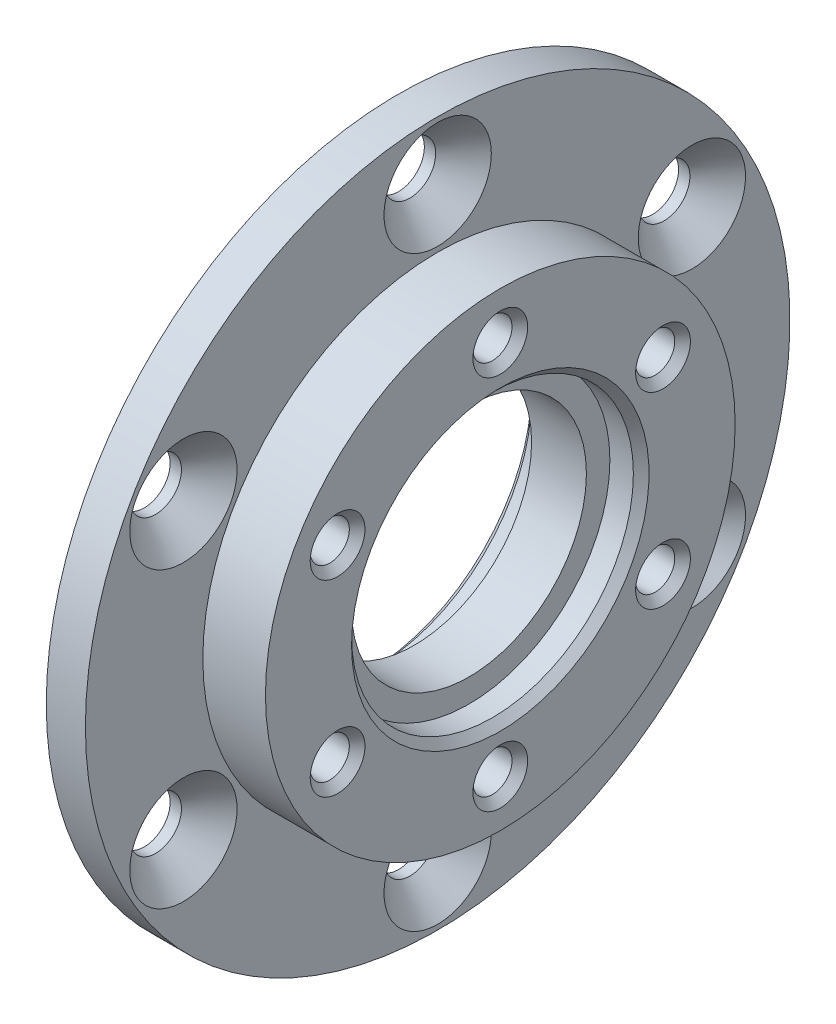
ISO-10303-21;
HEADER;
FILE_DESCRIPTION(('STEP AP214'),'2;1');
FILE_NAME('part.step','',(''),(''),'','','');
FILE_SCHEMA(('AUTOMOTIVE_DESIGN { 1 0 10303 214 1 1 1 1 }'));
ENDSEC;
DATA;
#1=APPLICATION_CONTEXT('core data for automotive mechanical design processes');
#2=APPLICATION_PROTOCOL_DEFINITION('international standard','automotive_design',2000,#1);
#3=PRODUCT_CONTEXT('',#1,'mechanical');
#4=PRODUCT('Part','Part','',(#3));
#5=PRODUCT_RELATED_PRODUCT_CATEGORY('part','',(#4));
#6=PRODUCT_DEFINITION_FORMATION('','',#4);
#7=PRODUCT_DEFINITION_CONTEXT('part definition',#1,'design');
#8=PRODUCT_DEFINITION('design','',#6,#7);
#9=PRODUCT_DEFINITION_SHAPE('','',#8);
#10=(LENGTH_UNIT() NAMED_UNIT(*) SI_UNIT(.MILLI.,.METRE.));
#11=(NAMED_UNIT(*) PLANE_ANGLE_UNIT() SI_UNIT($,.RADIAN.));
#12=(NAMED_UNIT(*) SI_UNIT($,.STERADIAN.) SOLID_ANGLE_UNIT());
#13=UNCERTAINTY_MEASURE_WITH_UNIT(LENGTH_MEASURE(1.E-05),#10,'distance_accuracy_value','');
#14=(GEOMETRIC_REPRESENTATION_CONTEXT(3) GLOBAL_UNCERTAINTY_ASSIGNED_CONTEXT((#13)) GLOBAL_UNIT_ASSIGNED_CONTEXT((#10,
#11,#12)) REPRESENTATION_CONTEXT('',''));
#15=CARTESIAN_POINT('',(0.,0.,0.));
#16=DIRECTION('',(0.,0.,1.));
#17=DIRECTION('',(1.,0.,0.));
#18=AXIS2_PLACEMENT_3D('',#15,#16,#17);
#19=CARTESIAN_POINT('',(0.,0.,0.));
#20=DIRECTION('',(-1.,0.,0.));
#21=DIRECTION('',(0.,0.,1.));
#22=AXIS2_PLACEMENT_3D('',#19,#20,#21);
#23=CYLINDRICAL_SURFACE('',#22,15.);
#24=CARTESIAN_POINT('',(6.,0.,0.));
#25=DIRECTION('',(-1.,0.,0.));
#26=DIRECTION('',(0.,0.,1.));
#27=AXIS2_PLACEMENT_3D('',#24,#25,#26);
#28=CIRCLE('',#27,15.);
#29=CARTESIAN_POINT('',(6.,0.,15.));
#30=VERTEX_POINT('',#29);
#31=EDGE_CURVE('E117',#30,#30,#28,.T.);
#32=ORIENTED_EDGE('',*,*,#31,.T.);
#33=EDGE_LOOP('',(#32));
#34=FACE_BOUND('',#33,.T.);
#35=CARTESIAN_POINT('',(13.,0.,0.));
#36=DIRECTION('',(1.,0.,0.));
#37=DIRECTION('',(0.,0.,-1.));
#38=AXIS2_PLACEMENT_3D('',#35,#36,#37);
#39=CIRCLE('',#38,15.);
#40=CARTESIAN_POINT('',(13.,0.,-15.));
#41=VERTEX_POINT('',#40);
#42=EDGE_CURVE('E230',#41,#41,#39,.T.);
#43=ORIENTED_EDGE('',*,*,#42,.T.);
#44=EDGE_LOOP('',(#43));
#45=FACE_BOUND('',#44,.T.);
#46=ADVANCED_FACE('F53',(#34,#45),#23,.F.);
#47=CARTESIAN_POINT('',(9.,45.,0.));
#48=DIRECTION('',(-1.,0.,0.));
#49=DIRECTION('',(0.,0.,1.));
#50=AXIS2_PLACEMENT_3D('',#47,#48,#49);
#51=PLANE('',#50);
#52=CARTESIAN_POINT('',(9.,18.7500000000004,32.4759526419162));
#53=DIRECTION('',(1.,0.,0.));
#54=DIRECTION('',(0.,0.,-1.));
#55=AXIS2_PLACEMENT_3D('',#52,#53,#54);
#56=CIRCLE('',#55,6.855);
#57=CARTESIAN_POINT('',(9.,18.7500000000004,25.6209526419162));
#58=VERTEX_POINT('',#57);
#59=EDGE_CURVE('E229',#58,#58,#56,.T.);
#60=ORIENTED_EDGE('',*,*,#59,.F.);
#61=EDGE_LOOP('',(#60));
#62=FACE_BOUND('',#61,.T.);
#63=CARTESIAN_POINT('',(9.,-37.5,0.));
#64=DIRECTION('',(1.,0.,0.));
#65=DIRECTION('',(0.,0.,-1.));
#66=AXIS2_PLACEMENT_3D('',#63,#64,#65);
#67=CIRCLE('',#66,6.855);
#68=CARTESIAN_POINT('',(9.,-37.5,-6.855));
#69=VERTEX_POINT('',#68);
#70=EDGE_CURVE('E154',#69,#69,#67,.T.);
#71=ORIENTED_EDGE('',*,*,#70,.F.);
#72=EDGE_LOOP('',(#71));
#73=FACE_BOUND('',#72,.T.);
#74=CARTESIAN_POINT('',(9.,-18.7500000000002,-32.4759526419164));
#75=DIRECTION('',(1.,0.,0.));
#76=DIRECTION('',(0.,0.,-1.));
#77=AXIS2_PLACEMENT_3D('',#74,#75,#76);
#78=CIRCLE('',#77,6.855);
#79=CARTESIAN_POINT('',(9.,-18.7500000000002,-39.3309526419164));
#80=VERTEX_POINT('',#79);
#81=EDGE_CURVE('E149',#80,#80,#78,.T.);
#82=ORIENTED_EDGE('',*,*,#81,.F.);
#83=EDGE_LOOP('',(#82));
#84=FACE_BOUND('',#83,.T.);
#85=CARTESIAN_POINT('',(9.,18.7499999999999,-32.4759526419165));
#86=DIRECTION('',(1.,0.,0.));
#87=DIRECTION('',(0.,0.,-1.));
#88=AXIS2_PLACEMENT_3D('',#85,#86,#87);
#89=CIRCLE('',#88,6.855);
#90=CARTESIAN_POINT('',(9.,18.7499999999999,-39.3309526419165));
#91=VERTEX_POINT('',#90);
#92=EDGE_CURVE('E144',#91,#91,#89,.T.);
#93=ORIENTED_EDGE('',*,*,#92,.F.);
#94=EDGE_LOOP('',(#93));
#95=FACE_BOUND('',#94,.T.);
#96=CARTESIAN_POINT('',(9.,37.5,0.));
#97=DIRECTION('',(1.,0.,0.));
#98=DIRECTION('',(0.,0.,-1.));
#99=AXIS2_PLACEMENT_3D('',#96,#97,#98);
#100=CIRCLE('',#99,6.855);
#101=CARTESIAN_POINT('',(9.,37.5,-6.855));
#102=VERTEX_POINT('',#101);
#103=EDGE_CURVE('E139',#102,#102,#100,.T.);
#104=ORIENTED_EDGE('',*,*,#103,.F.);
#105=EDGE_LOOP('',(#104));
#106=FACE_BOUND('',#105,.T.);
#107=CARTESIAN_POINT('',(9.,0.,0.));
#108=DIRECTION('',(-1.,0.,0.));
#109=DIRECTION('',(0.,0.,1.));
#110=AXIS2_PLACEMENT_3D('',#107,#108,#109);
#111=CIRCLE('',#110,45.);
#112=CARTESIAN_POINT('',(9.,0.,45.));
#113=VERTEX_POINT('',#112);
#114=EDGE_CURVE('E126',#113,#113,#111,.T.);
#115=ORIENTED_EDGE('',*,*,#114,.F.);
#116=EDGE_LOOP('',(#115));
#117=FACE_BOUND('',#116,.T.);
#118=CARTESIAN_POINT('',(9.,0.,0.));
#119=DIRECTION('',(-1.,0.,0.));
#120=DIRECTION('',(0.,0.,1.));
#121=AXIS2_PLACEMENT_3D('',#118,#119,#120);
#122=CIRCLE('',#121,30.);
#123=CARTESIAN_POINT('',(9.,0.,30.));
#124=VERTEX_POINT('',#123);
#125=EDGE_CURVE('E123',#124,#124,#122,.T.);
#126=ORIENTED_EDGE('',*,*,#125,.T.);
#127=EDGE_LOOP('',(#126));
#128=FACE_BOUND('',#127,.T.);
#129=CARTESIAN_POINT('',(9.,-18.7499999999997,32.4759526419166));
#130=DIRECTION('',(1.,0.,0.));
#131=DIRECTION('',(0.,0.,-1.));
#132=AXIS2_PLACEMENT_3D('',#129,#130,#131);
#133=CIRCLE('',#132,6.855);
#134=CARTESIAN_POINT('',(9.,-18.7499999999997,25.6209526419166));
#135=VERTEX_POINT('',#134);
#136=EDGE_CURVE('E159',#135,#135,#133,.T.);
#137=ORIENTED_EDGE('',*,*,#136,.F.);
#138=EDGE_LOOP('',(#137));
#139=FACE_BOUND('',#138,.T.);
#140=ADVANCED_FACE('F278',(#62,#73,#84,#95,#106,#117,#128,#139),#51,.F.);
#141=CARTESIAN_POINT('',(17.,30.,0.));
#142=DIRECTION('',(-1.,0.,0.));
#143=DIRECTION('',(0.,0.,1.));
#144=AXIS2_PLACEMENT_3D('',#141,#142,#143);
#145=PLANE('',#144);
#146=CARTESIAN_POINT('',(17.,0.,0.));
#147=DIRECTION('',(-1.,0.,0.));
#148=DIRECTION('',(0.,0.,1.));
#149=AXIS2_PLACEMENT_3D('',#146,#147,#148);
#150=CIRCLE('',#149,19.);
#151=CARTESIAN_POINT('',(17.,0.,19.));
#152=VERTEX_POINT('',#151);
#153=EDGE_CURVE('E62',#152,#152,#150,.T.);
#154=ORIENTED_EDGE('',*,*,#153,.T.);
#155=EDGE_LOOP('',(#154));
#156=FACE_BOUND('',#155,.T.);
#157=CARTESIAN_POINT('',(17.,-24.,0.));
#158=DIRECTION('',(-1.,0.,0.));
#159=DIRECTION('',(0.,0.,1.));
#160=AXIS2_PLACEMENT_3D('',#157,#158,#159);
#161=CIRCLE('',#160,3.50000000000002);
#162=CARTESIAN_POINT('',(17.,-24.,3.50000000000002));
#163=VERTEX_POINT('',#162);
#164=EDGE_CURVE('E178',#163,#163,#161,.T.);
#165=ORIENTED_EDGE('',*,*,#164,.T.);
#166=EDGE_LOOP('',(#165));
#167=FACE_BOUND('',#166,.T.);
#168=CARTESIAN_POINT('',(17.,-12.0000000000001,-20.7846096908265));
#169=DIRECTION('',(-1.,0.,0.));
#170=DIRECTION('',(0.,0.,1.));
#171=AXIS2_PLACEMENT_3D('',#168,#169,#170);
#172=CIRCLE('',#171,3.49999999999998);
#173=CARTESIAN_POINT('',(17.,-12.0000000000001,-17.2846096908265));
#174=VERTEX_POINT('',#173);
#175=EDGE_CURVE('E175',#174,#174,#172,.T.);
#176=ORIENTED_EDGE('',*,*,#175,.T.);
#177=EDGE_LOOP('',(#176));
#178=FACE_BOUND('',#177,.T.);
#179=CARTESIAN_POINT('',(17.,-11.9999999999998,20.7846096908266));
#180=DIRECTION('',(-1.,0.,0.));
#181=DIRECTION('',(0.,0.,1.));
#182=AXIS2_PLACEMENT_3D('',#179,#180,#181);
#183=CIRCLE('',#182,3.49999999999998);
#184=CARTESIAN_POINT('',(17.,-11.9999999999998,24.2846096908266));
#185=VERTEX_POINT('',#184);
#186=EDGE_CURVE('E172',#185,#185,#183,.T.);
#187=ORIENTED_EDGE('',*,*,#186,.T.);
#188=EDGE_LOOP('',(#187));
#189=FACE_BOUND('',#188,.T.);
#190=CARTESIAN_POINT('',(17.,12.0000000000002,20.7846096908264));
#191=DIRECTION('',(-1.,0.,0.));
#192=DIRECTION('',(0.,0.,1.));
#193=AXIS2_PLACEMENT_3D('',#190,#191,#192);
#194=CIRCLE('',#193,3.49999999999998);
#195=CARTESIAN_POINT('',(17.,12.0000000000002,24.2846096908264));
#196=VERTEX_POINT('',#195);
#197=EDGE_CURVE('E169',#196,#196,#194,.T.);
#198=ORIENTED_EDGE('',*,*,#197,.T.);
#199=EDGE_LOOP('',(#198));
#200=FACE_BOUND('',#199,.T.);
#201=CARTESIAN_POINT('',(17.,12.,-20.7846096908266));
#202=DIRECTION('',(-1.,0.,0.));
#203=DIRECTION('',(0.,0.,1.));
#204=AXIS2_PLACEMENT_3D('',#201,#202,#203);
#205=CIRCLE('',#204,3.50000000000002);
#206=CARTESIAN_POINT('',(17.,12.,-17.2846096908265));
#207=VERTEX_POINT('',#206);
#208=EDGE_CURVE('E166',#207,#207,#205,.T.);
#209=ORIENTED_EDGE('',*,*,#208,.T.);
#210=EDGE_LOOP('',(#209));
#211=FACE_BOUND('',#210,.T.);
#212=CARTESIAN_POINT('',(17.,24.,0.));
#213=DIRECTION('',(-1.,0.,0.));
#214=DIRECTION('',(0.,0.,1.));
#215=AXIS2_PLACEMENT_3D('',#212,#213,#214);
#216=CIRCLE('',#215,3.50000000000002);
#217=CARTESIAN_POINT('',(17.,24.,3.50000000000002));
#218=VERTEX_POINT('',#217);
#219=EDGE_CURVE('E163',#218,#218,#216,.T.);
#220=ORIENTED_EDGE('',*,*,#219,.T.);
#221=EDGE_LOOP('',(#220));
#222=FACE_BOUND('',#221,.T.);
#223=CARTESIAN_POINT('',(17.,0.,0.));
#224=DIRECTION('',(-1.,0.,0.));
#225=DIRECTION('',(0.,0.,1.));
#226=AXIS2_PLACEMENT_3D('',#223,#224,#225);
#227=CIRCLE('',#226,30.);
#228=CARTESIAN_POINT('',(17.,0.,30.));
#229=VERTEX_POINT('',#228);
#230=EDGE_CURVE('E120',#229,#229,#227,.T.);
#231=ORIENTED_EDGE('',*,*,#230,.F.);
#232=EDGE_LOOP('',(#231));
#233=FACE_BOUND('',#232,.T.);
#234=ADVANCED_FACE('F210',(#156,#167,#178,#189,#200,#211,#222,#233),#145,.F.);
#235=CARTESIAN_POINT('',(0.,0.,0.));
#236=DIRECTION('',(-1.,0.,0.));
#237=DIRECTION('',(0.,0.,1.));
#238=AXIS2_PLACEMENT_3D('',#235,#236,#237);
#239=CYLINDRICAL_SURFACE('',#238,20.);
#240=CARTESIAN_POINT('',(0.999999999999973,0.,0.));
#241=DIRECTION('',(1.,0.,0.));
#242=DIRECTION('',(0.,0.,-1.));
#243=AXIS2_PLACEMENT_3D('',#240,#241,#242);
#244=CIRCLE('',#243,20.);
#245=CARTESIAN_POINT('',(0.999999999999973,0.,-20.));
#246=VERTEX_POINT('',#245);
#247=EDGE_CURVE('E11',#246,#246,#244,.F.);
#248=ORIENTED_EDGE('',*,*,#247,.T.);
#249=EDGE_LOOP('',(#248));
#250=FACE_BOUND('',#249,.T.);
#251=CARTESIAN_POINT('',(6.,0.,0.));
#252=DIRECTION('',(-1.,0.,0.));
#253=DIRECTION('',(0.,0.,1.));
#254=AXIS2_PLACEMENT_3D('',#251,#252,#253);
#255=CIRCLE('',#254,20.);
#256=CARTESIAN_POINT('',(6.,0.,20.));
#257=VERTEX_POINT('',#256);
#258=EDGE_CURVE('E114',#257,#257,#255,.T.);
#259=ORIENTED_EDGE('',*,*,#258,.F.);
#260=EDGE_LOOP('',(#259));
#261=FACE_BOUND('',#260,.T.);
#262=ADVANCED_FACE('F295',(#250,#261),#239,.F.);
#263=CARTESIAN_POINT('',(0.,20.,0.));
#264=DIRECTION('',(1.,0.,0.));
#265=DIRECTION('',(0.,0.,-1.));
#266=AXIS2_PLACEMENT_3D('',#263,#264,#265);
#267=PLANE('',#266);
#268=CARTESIAN_POINT('',(0.,0.,0.));
#269=DIRECTION('',(1.,0.,0.));
#270=DIRECTION('',(0.,0.,-1.));
#271=AXIS2_PLACEMENT_3D('',#268,#269,#270);
#272=CIRCLE('',#271,26.5);
#273=CARTESIAN_POINT('',(0.,0.,-26.5));
#274=VERTEX_POINT('',#273);
#275=EDGE_CURVE('E199',#274,#274,#272,.F.);
#276=ORIENTED_EDGE('',*,*,#275,.T.);
#277=EDGE_LOOP('',(#276));
#278=FACE_BOUND('',#277,.T.);
#279=CARTESIAN_POINT('',(0.,0.,0.));
#280=DIRECTION('',(1.,0.,0.));
#281=DIRECTION('',(0.,0.,-1.));
#282=AXIS2_PLACEMENT_3D('',#279,#280,#281);
#283=CIRCLE('',#282,21.);
#284=CARTESIAN_POINT('',(0.,0.,-21.));
#285=VERTEX_POINT('',#284);
#286=EDGE_CURVE('E196',#285,#285,#283,.T.);
#287=ORIENTED_EDGE('',*,*,#286,.T.);
#288=EDGE_LOOP('',(#287));
#289=FACE_BOUND('',#288,.T.);
#290=ADVANCED_FACE('F311',(#278,#289),#267,.F.);
#291=CARTESIAN_POINT('',(0.,0.,0.));
#292=DIRECTION('',(-1.,0.,0.));
#293=DIRECTION('',(0.,0.,1.));
#294=AXIS2_PLACEMENT_3D('',#291,#292,#293);
#295=CYLINDRICAL_SURFACE('',#294,27.5);
#296=CARTESIAN_POINT('',(0.999999999999987,0.,0.));
#297=DIRECTION('',(1.,0.,0.));
#298=DIRECTION('',(0.,0.,-1.));
#299=AXIS2_PLACEMENT_3D('',#296,#297,#298);
#300=CIRCLE('',#299,27.5);
#301=CARTESIAN_POINT('',(0.999999999999987,0.,-27.5));
#302=VERTEX_POINT('',#301);
#303=EDGE_CURVE('E202',#302,#302,#300,.T.);
#304=ORIENTED_EDGE('',*,*,#303,.T.);
#305=EDGE_LOOP('',(#304));
#306=FACE_BOUND('',#305,.T.);
#307=CARTESIAN_POINT('',(4.,0.,0.));
#308=DIRECTION('',(-1.,0.,0.));
#309=DIRECTION('',(0.,0.,1.));
#310=AXIS2_PLACEMENT_3D('',#307,#308,#309);
#311=CIRCLE('',#310,27.5);
#312=CARTESIAN_POINT('',(4.,0.,27.5));
#313=VERTEX_POINT('',#312);
#314=EDGE_CURVE('E132',#313,#313,#311,.T.);
#315=ORIENTED_EDGE('',*,*,#314,.T.);
#316=EDGE_LOOP('',(#315));
#317=FACE_BOUND('',#316,.T.);
#318=ADVANCED_FACE('F307',(#306,#317),#295,.T.);
#319=CARTESIAN_POINT('',(4.,27.5,0.));
#320=DIRECTION('',(1.,0.,0.));
#321=DIRECTION('',(0.,0.,-1.));
#322=AXIS2_PLACEMENT_3D('',#319,#320,#321);
#323=PLANE('',#322);
#324=CARTESIAN_POINT('',(4.,18.7500000000004,32.4759526419162));
#325=DIRECTION('',(1.,0.,0.));
#326=DIRECTION('',(0.,0.,-1.));
#327=AXIS2_PLACEMENT_3D('',#324,#325,#326);
#328=CIRCLE('',#327,3.3);
#329=CARTESIAN_POINT('',(4.,18.7500000000004,29.1759526419162));
#330=VERTEX_POINT('',#329);
#331=EDGE_CURVE('E156',#330,#330,#328,.T.);
#332=ORIENTED_EDGE('',*,*,#331,.T.);
#333=EDGE_LOOP('',(#332));
#334=FACE_BOUND('',#333,.T.);
#335=CARTESIAN_POINT('',(4.,-18.7499999999997,32.4759526419166));
#336=DIRECTION('',(1.,0.,0.));
#337=DIRECTION('',(0.,0.,-1.));
#338=AXIS2_PLACEMENT_3D('',#335,#336,#337);
#339=CIRCLE('',#338,3.3);
#340=CARTESIAN_POINT('',(4.,-18.7499999999997,29.1759526419166));
#341=VERTEX_POINT('',#340);
#342=EDGE_CURVE('E151',#341,#341,#339,.T.);
#343=ORIENTED_EDGE('',*,*,#342,.T.);
#344=EDGE_LOOP('',(#343));
#345=FACE_BOUND('',#344,.T.);
#346=CARTESIAN_POINT('',(4.,-37.5,0.));
#347=DIRECTION('',(1.,0.,0.));
#348=DIRECTION('',(0.,0.,-1.));
#349=AXIS2_PLACEMENT_3D('',#346,#347,#348);
#350=CIRCLE('',#349,3.3);
#351=CARTESIAN_POINT('',(4.,-37.5,-3.3));
#352=VERTEX_POINT('',#351);
#353=EDGE_CURVE('E146',#352,#352,#350,.T.);
#354=ORIENTED_EDGE('',*,*,#353,.T.);
#355=EDGE_LOOP('',(#354));
#356=FACE_BOUND('',#355,.T.);
#357=CARTESIAN_POINT('',(4.,-18.7500000000002,-32.4759526419164));
#358=DIRECTION('',(1.,0.,0.));
#359=DIRECTION('',(0.,0.,-1.));
#360=AXIS2_PLACEMENT_3D('',#357,#358,#359);
#361=CIRCLE('',#360,3.3);
#362=CARTESIAN_POINT('',(4.,-18.7500000000002,-35.7759526419164));
#363=VERTEX_POINT('',#362);
#364=EDGE_CURVE('E141',#363,#363,#361,.T.);
#365=ORIENTED_EDGE('',*,*,#364,.T.);
#366=EDGE_LOOP('',(#365));
#367=FACE_BOUND('',#366,.T.);
#368=CARTESIAN_POINT('',(4.,18.7499999999999,-32.4759526419165));
#369=DIRECTION('',(1.,0.,0.));
#370=DIRECTION('',(0.,0.,-1.));
#371=AXIS2_PLACEMENT_3D('',#368,#369,#370);
#372=CIRCLE('',#371,3.3);
#373=CARTESIAN_POINT('',(4.,18.7499999999999,-35.7759526419165));
#374=VERTEX_POINT('',#373);
#375=EDGE_CURVE('E136',#374,#374,#372,.T.);
#376=ORIENTED_EDGE('',*,*,#375,.T.);
#377=EDGE_LOOP('',(#376));
#378=FACE_BOUND('',#377,.T.);
#379=CARTESIAN_POINT('',(4.,37.5,0.));
#380=DIRECTION('',(1.,0.,0.));
#381=DIRECTION('',(0.,0.,-1.));
#382=AXIS2_PLACEMENT_3D('',#379,#380,#381);
#383=CIRCLE('',#382,3.3);
#384=CARTESIAN_POINT('',(4.,37.5,-3.3));
#385=VERTEX_POINT('',#384);
#386=EDGE_CURVE('E92',#385,#385,#383,.T.);
#387=ORIENTED_EDGE('',*,*,#386,.T.);
#388=EDGE_LOOP('',(#387));
#389=FACE_BOUND('',#388,.T.);
#390=ORIENTED_EDGE('',*,*,#314,.F.);
#391=EDGE_LOOP('',(#390));
#392=FACE_BOUND('',#391,.T.);
#393=CARTESIAN_POINT('',(4.,0.,0.));
#394=DIRECTION('',(-1.,0.,0.));
#395=DIRECTION('',(0.,0.,1.));
#396=AXIS2_PLACEMENT_3D('',#393,#394,#395);
#397=CIRCLE('',#396,45.);
#398=CARTESIAN_POINT('',(4.,0.,45.));
#399=VERTEX_POINT('',#398);
#400=EDGE_CURVE('E129',#399,#399,#397,.T.);
#401=ORIENTED_EDGE('',*,*,#400,.T.);
#402=EDGE_LOOP('',(#401));
#403=FACE_BOUND('',#402,.T.);
#404=ADVANCED_FACE('F303',(#334,#345,#356,#367,#378,#389,#392,#403),#323,.F.);
#405=CARTESIAN_POINT('',(0.,0.,0.));
#406=DIRECTION('',(-1.,0.,0.));
#407=DIRECTION('',(0.,0.,1.));
#408=AXIS2_PLACEMENT_3D('',#405,#406,#407);
#409=CYLINDRICAL_SURFACE('',#408,45.);
#410=ORIENTED_EDGE('',*,*,#400,.F.);
#411=EDGE_LOOP('',(#410));
#412=FACE_BOUND('',#411,.T.);
#413=ORIENTED_EDGE('',*,*,#114,.T.);
#414=EDGE_LOOP('',(#413));
#415=FACE_BOUND('',#414,.T.);
#416=ADVANCED_FACE('F298',(#412,#415),#409,.T.);
#417=CARTESIAN_POINT('',(0.,0.,0.));
#418=DIRECTION('',(-1.,0.,0.));
#419=DIRECTION('',(0.,0.,1.));
#420=AXIS2_PLACEMENT_3D('',#417,#418,#419);
#421=CYLINDRICAL_SURFACE('',#420,30.);
#422=ORIENTED_EDGE('',*,*,#125,.F.);
#423=EDGE_LOOP('',(#422));
#424=FACE_BOUND('',#423,.T.);
#425=ORIENTED_EDGE('',*,*,#230,.T.);
#426=EDGE_LOOP('',(#425));
#427=FACE_BOUND('',#426,.T.);
#428=ADVANCED_FACE('F296',(#424,#427),#421,.T.);
#429=CARTESIAN_POINT('',(6.,15.,0.));
#430=DIRECTION('',(1.,0.,0.));
#431=DIRECTION('',(0.,0.,-1.));
#432=AXIS2_PLACEMENT_3D('',#429,#430,#431);
#433=PLANE('',#432);
#434=ORIENTED_EDGE('',*,*,#31,.F.);
#435=EDGE_LOOP('',(#434));
#436=FACE_BOUND('',#435,.T.);
#437=ORIENTED_EDGE('',*,*,#258,.T.);
#438=EDGE_LOOP('',(#437));
#439=FACE_BOUND('',#438,.T.);
#440=ADVANCED_FACE('F291',(#436,#439),#433,.F.);
#441=CARTESIAN_POINT('',(8.5021515475689,24.,0.));
#442=DIRECTION('',(1.,0.,0.));
#443=DIRECTION('',(0.,0.,-1.));
#444=AXIS2_PLACEMENT_3D('',#441,#442,#443);
#445=CONICAL_SURFACE('',#444,2.5,1.02974425867665);
#446=CARTESIAN_POINT('',(7.,24.,0.));
#447=VERTEX_POINT('',#446);
#448=VERTEX_LOOP('',#447);
#449=FACE_BOUND('',#448,.T.);
#450=CARTESIAN_POINT('',(8.5021515475689,24.,0.));
#451=DIRECTION('',(1.,0.,0.));
#452=DIRECTION('',(0.,0.,-1.));
#453=AXIS2_PLACEMENT_3D('',#450,#451,#452);
#454=CIRCLE('',#453,2.5);
#455=CARTESIAN_POINT('',(8.5021515475689,24.,-2.5));
#456=VERTEX_POINT('',#455);
#457=EDGE_CURVE('E111',#456,#456,#454,.T.);
#458=ORIENTED_EDGE('',*,*,#457,.T.);
#459=EDGE_LOOP('',(#458));
#460=FACE_BOUND('',#459,.T.);
#461=ADVANCED_FACE('F386',(#449,#460),#445,.F.);
#462=CARTESIAN_POINT('',(17.,24.,0.));
#463=DIRECTION('',(1.,0.,0.));
#464=DIRECTION('',(0.,0.,-1.));
#465=AXIS2_PLACEMENT_3D('',#462,#463,#464);
#466=CYLINDRICAL_SURFACE('',#465,2.5);
#467=CARTESIAN_POINT('',(16.,24.,0.));
#468=DIRECTION('',(-1.,0.,0.));
#469=DIRECTION('',(0.,0.,1.));
#470=AXIS2_PLACEMENT_3D('',#467,#468,#469);
#471=CIRCLE('',#470,2.5);
#472=CARTESIAN_POINT('',(16.,24.,2.5));
#473=VERTEX_POINT('',#472);
#474=EDGE_CURVE('E193',#473,#473,#471,.F.);
#475=ORIENTED_EDGE('',*,*,#474,.T.);
#476=EDGE_LOOP('',(#475));
#477=FACE_BOUND('',#476,.T.);
#478=ORIENTED_EDGE('',*,*,#457,.F.);
#479=EDGE_LOOP('',(#478));
#480=FACE_BOUND('',#479,.T.);
#481=ADVANCED_FACE('F391',(#477,#480),#466,.F.);
#482=CARTESIAN_POINT('',(8.5021515475689,12.,-20.7846096908266));
#483=DIRECTION('',(1.,0.,0.));
#484=DIRECTION('',(0.,0.,-1.));
#485=AXIS2_PLACEMENT_3D('',#482,#483,#484);
#486=CONICAL_SURFACE('',#485,2.5,1.02974425867665);
#487=CARTESIAN_POINT('',(7.,11.9999999999999,-20.7846096908266));
#488=VERTEX_POINT('',#487);
#489=VERTEX_LOOP('',#488);
#490=FACE_BOUND('',#489,.T.);
#491=CARTESIAN_POINT('',(8.5021515475689,12.,-20.7846096908266));
#492=DIRECTION('',(1.,0.,0.));
#493=DIRECTION('',(0.,0.,-1.));
#494=AXIS2_PLACEMENT_3D('',#491,#492,#493);
#495=CIRCLE('',#494,2.5);
#496=CARTESIAN_POINT('',(8.5021515475689,12.,-23.2846096908266));
#497=VERTEX_POINT('',#496);
#498=EDGE_CURVE('E108',#497,#497,#495,.T.);
#499=ORIENTED_EDGE('',*,*,#498,.T.);
#500=EDGE_LOOP('',(#499));
#501=FACE_BOUND('',#500,.T.);
#502=ADVANCED_FACE('F397',(#490,#501),#486,.F.);
#503=CARTESIAN_POINT('',(17.,12.,-20.7846096908266));
#504=DIRECTION('',(1.,0.,0.));
#505=DIRECTION('',(0.,0.,-1.));
#506=AXIS2_PLACEMENT_3D('',#503,#504,#505);
#507=CYLINDRICAL_SURFACE('',#506,2.5);
#508=CARTESIAN_POINT('',(16.,12.,-20.7846096908266));
#509=DIRECTION('',(-1.,0.,0.));
#510=DIRECTION('',(0.,0.,1.));
#511=AXIS2_PLACEMENT_3D('',#508,#509,#510);
#512=CIRCLE('',#511,2.5);
#513=CARTESIAN_POINT('',(16.,12.,-18.2846096908266));
#514=VERTEX_POINT('',#513);
#515=EDGE_CURVE('E190',#514,#514,#512,.F.);
#516=ORIENTED_EDGE('',*,*,#515,.T.);
#517=EDGE_LOOP('',(#516));
#518=FACE_BOUND('',#517,.T.);
#519=ORIENTED_EDGE('',*,*,#498,.F.);
#520=EDGE_LOOP('',(#519));
#521=FACE_BOUND('',#520,.T.);
#522=ADVANCED_FACE('F403',(#518,#521),#507,.F.);
#523=CARTESIAN_POINT('',(8.5021515475689,-12.0000000000001,-20.7846096908265));
#524=DIRECTION('',(1.,0.,0.));
#525=DIRECTION('',(0.,0.,-1.));
#526=AXIS2_PLACEMENT_3D('',#523,#524,#525);
#527=CONICAL_SURFACE('',#526,2.5,1.02974425867665);
#528=CARTESIAN_POINT('',(7.,-12.0000000000001,-20.7846096908265));
#529=VERTEX_POINT('',#528);
#530=VERTEX_LOOP('',#529);
#531=FACE_BOUND('',#530,.T.);
#532=CARTESIAN_POINT('',(8.5021515475689,-12.0000000000001,-20.7846096908265));
#533=DIRECTION('',(1.,0.,0.));
#534=DIRECTION('',(0.,0.,-1.));
#535=AXIS2_PLACEMENT_3D('',#532,#533,#534);
#536=CIRCLE('',#535,2.5);
#537=CARTESIAN_POINT('',(8.5021515475689,-12.0000000000001,-23.2846096908265));
#538=VERTEX_POINT('',#537);
#539=EDGE_CURVE('E105',#538,#538,#536,.T.);
#540=ORIENTED_EDGE('',*,*,#539,.T.);
#541=EDGE_LOOP('',(#540));
#542=FACE_BOUND('',#541,.T.);
#543=ADVANCED_FACE('F406',(#531,#542),#527,.F.);
#544=CARTESIAN_POINT('',(17.,-12.0000000000001,-20.7846096908265));
#545=DIRECTION('',(1.,0.,0.));
#546=DIRECTION('',(0.,0.,-1.));
#547=AXIS2_PLACEMENT_3D('',#544,#545,#546);
#548=CYLINDRICAL_SURFACE('',#547,2.5);
#549=CARTESIAN_POINT('',(16.,-12.0000000000001,-20.7846096908265));
#550=DIRECTION('',(-1.,0.,0.));
#551=DIRECTION('',(0.,0.,1.));
#552=AXIS2_PLACEMENT_3D('',#549,#550,#551);
#553=CIRCLE('',#552,2.5);
#554=CARTESIAN_POINT('',(16.,-12.0000000000001,-18.2846096908265));
#555=VERTEX_POINT('',#554);
#556=EDGE_CURVE('E181',#555,#555,#553,.F.);
#557=ORIENTED_EDGE('',*,*,#556,.T.);
#558=EDGE_LOOP('',(#557));
#559=FACE_BOUND('',#558,.T.);
#560=ORIENTED_EDGE('',*,*,#539,.F.);
#561=EDGE_LOOP('',(#560));
#562=FACE_BOUND('',#561,.T.);
#563=ADVANCED_FACE('F410',(#559,#562),#548,.F.);
#564=CARTESIAN_POINT('',(8.5021515475689,-24.,0.));
#565=DIRECTION('',(1.,0.,0.));
#566=DIRECTION('',(0.,0.,-1.));
#567=AXIS2_PLACEMENT_3D('',#564,#565,#566);
#568=CONICAL_SURFACE('',#567,2.5,1.02974425867665);
#569=CARTESIAN_POINT('',(7.,-24.,0.));
#570=VERTEX_POINT('',#569);
#571=VERTEX_LOOP('',#570);
#572=FACE_BOUND('',#571,.T.);
#573=CARTESIAN_POINT('',(8.5021515475689,-24.,0.));
#574=DIRECTION('',(1.,0.,0.));
#575=DIRECTION('',(0.,0.,-1.));
#576=AXIS2_PLACEMENT_3D('',#573,#574,#575);
#577=CIRCLE('',#576,2.5);
#578=CARTESIAN_POINT('',(8.5021515475689,-24.,-2.5));
#579=VERTEX_POINT('',#578);
#580=EDGE_CURVE('E95',#579,#579,#577,.T.);
#581=ORIENTED_EDGE('',*,*,#580,.T.);
#582=EDGE_LOOP('',(#581));
#583=FACE_BOUND('',#582,.T.);
#584=ADVANCED_FACE('F414',(#572,#583),#568,.F.);
#585=CARTESIAN_POINT('',(17.,-24.,0.));
#586=DIRECTION('',(1.,0.,0.));
#587=DIRECTION('',(0.,0.,-1.));
#588=AXIS2_PLACEMENT_3D('',#585,#586,#587);
#589=CYLINDRICAL_SURFACE('',#588,2.5);
#590=CARTESIAN_POINT('',(16.,-24.,0.));
#591=DIRECTION('',(-1.,0.,0.));
#592=DIRECTION('',(0.,0.,1.));
#593=AXIS2_PLACEMENT_3D('',#590,#591,#592);
#594=CIRCLE('',#593,2.5);
#595=CARTESIAN_POINT('',(16.,-24.,2.5));
#596=VERTEX_POINT('',#595);
#597=EDGE_CURVE('E134',#596,#596,#594,.F.);
#598=ORIENTED_EDGE('',*,*,#597,.T.);
#599=EDGE_LOOP('',(#598));
#600=FACE_BOUND('',#599,.T.);
#601=ORIENTED_EDGE('',*,*,#580,.F.);
#602=EDGE_LOOP('',(#601));
#603=FACE_BOUND('',#602,.T.);
#604=ADVANCED_FACE('F418',(#600,#603),#589,.F.);
#605=CARTESIAN_POINT('',(8.5021515475689,-11.9999999999998,20.7846096908266));
#606=DIRECTION('',(1.,0.,0.));
#607=DIRECTION('',(0.,0.,-1.));
#608=AXIS2_PLACEMENT_3D('',#605,#606,#607);
#609=CONICAL_SURFACE('',#608,2.5,1.02974425867665);
#610=CARTESIAN_POINT('',(7.,-11.9999999999998,20.7846096908266));
#611=VERTEX_POINT('',#610);
#612=VERTEX_LOOP('',#611);
#613=FACE_BOUND('',#612,.T.);
#614=CARTESIAN_POINT('',(8.5021515475689,-11.9999999999998,20.7846096908266));
#615=DIRECTION('',(1.,0.,0.));
#616=DIRECTION('',(0.,0.,-1.));
#617=AXIS2_PLACEMENT_3D('',#614,#615,#616);
#618=CIRCLE('',#617,2.5);
#619=CARTESIAN_POINT('',(8.5021515475689,-11.9999999999998,18.2846096908266));
#620=VERTEX_POINT('',#619);
#621=EDGE_CURVE('E91',#620,#620,#618,.T.);
#622=ORIENTED_EDGE('',*,*,#621,.T.);
#623=EDGE_LOOP('',(#622));
#624=FACE_BOUND('',#623,.T.);
#625=ADVANCED_FACE('F422',(#613,#624),#609,.F.);
#626=CARTESIAN_POINT('',(17.,-11.9999999999998,20.7846096908266));
#627=DIRECTION('',(1.,0.,0.));
#628=DIRECTION('',(0.,0.,-1.));
#629=AXIS2_PLACEMENT_3D('',#626,#627,#628);
#630=CYLINDRICAL_SURFACE('',#629,2.5);
#631=CARTESIAN_POINT('',(16.,-11.9999999999998,20.7846096908266));
#632=DIRECTION('',(-1.,0.,0.));
#633=DIRECTION('',(0.,0.,1.));
#634=AXIS2_PLACEMENT_3D('',#631,#632,#633);
#635=CIRCLE('',#634,2.5);
#636=CARTESIAN_POINT('',(16.,-11.9999999999998,23.2846096908266));
#637=VERTEX_POINT('',#636);
#638=EDGE_CURVE('E184',#637,#637,#635,.F.);
#639=ORIENTED_EDGE('',*,*,#638,.T.);
#640=EDGE_LOOP('',(#639));
#641=FACE_BOUND('',#640,.T.);
#642=ORIENTED_EDGE('',*,*,#621,.F.);
#643=EDGE_LOOP('',(#642));
#644=FACE_BOUND('',#643,.T.);
#645=ADVANCED_FACE('F85',(#641,#644),#630,.F.);
#646=CARTESIAN_POINT('',(8.5021515475689,12.0000000000002,20.7846096908264));
#647=DIRECTION('',(1.,0.,0.));
#648=DIRECTION('',(0.,0.,-1.));
#649=AXIS2_PLACEMENT_3D('',#646,#647,#648);
#650=CONICAL_SURFACE('',#649,2.5,1.02974425867665);
#651=CARTESIAN_POINT('',(7.,12.0000000000002,20.7846096908264));
#652=VERTEX_POINT('',#651);
#653=VERTEX_LOOP('',#652);
#654=FACE_BOUND('',#653,.T.);
#655=CARTESIAN_POINT('',(8.5021515475689,12.0000000000002,20.7846096908264));
#656=DIRECTION('',(1.,0.,0.));
#657=DIRECTION('',(0.,0.,-1.));
#658=AXIS2_PLACEMENT_3D('',#655,#656,#657);
#659=CIRCLE('',#658,2.5);
#660=CARTESIAN_POINT('',(8.5021515475689,12.0000000000002,18.2846096908264));
#661=VERTEX_POINT('',#660);
#662=EDGE_CURVE('E89',#661,#661,#659,.T.);
#663=ORIENTED_EDGE('',*,*,#662,.T.);
#664=EDGE_LOOP('',(#663));
#665=FACE_BOUND('',#664,.T.);
#666=ADVANCED_FACE('F81',(#654,#665),#650,.F.);
#667=CARTESIAN_POINT('',(17.,12.0000000000002,20.7846096908264));
#668=DIRECTION('',(1.,0.,0.));
#669=DIRECTION('',(0.,0.,-1.));
#670=AXIS2_PLACEMENT_3D('',#667,#668,#669);
#671=CYLINDRICAL_SURFACE('',#670,2.5);
#672=CARTESIAN_POINT('',(16.,12.0000000000002,20.7846096908264));
#673=DIRECTION('',(-1.,0.,0.));
#674=DIRECTION('',(0.,0.,1.));
#675=AXIS2_PLACEMENT_3D('',#672,#673,#674);
#676=CIRCLE('',#675,2.5);
#677=CARTESIAN_POINT('',(16.,12.0000000000002,23.2846096908264));
#678=VERTEX_POINT('',#677);
#679=EDGE_CURVE('E187',#678,#678,#676,.F.);
#680=ORIENTED_EDGE('',*,*,#679,.T.);
#681=EDGE_LOOP('',(#680));
#682=FACE_BOUND('',#681,.T.);
#683=ORIENTED_EDGE('',*,*,#662,.F.);
#684=EDGE_LOOP('',(#683));
#685=FACE_BOUND('',#684,.T.);
#686=ADVANCED_FACE('F84',(#682,#685),#671,.F.);
#687=CARTESIAN_POINT('',(9.,37.5,0.));
#688=DIRECTION('',(1.,0.,0.));
#689=DIRECTION('',(0.,0.,-1.));
#690=AXIS2_PLACEMENT_3D('',#687,#688,#689);
#691=CYLINDRICAL_SURFACE('',#690,3.3);
#692=CARTESIAN_POINT('',(5.445,37.5,0.));
#693=DIRECTION('',(1.,0.,0.));
#694=DIRECTION('',(0.,0.,-1.));
#695=AXIS2_PLACEMENT_3D('',#692,#693,#694);
#696=CIRCLE('',#695,3.3);
#697=CARTESIAN_POINT('',(5.445,37.5,-3.3));
#698=VERTEX_POINT('',#697);
#699=EDGE_CURVE('E98',#698,#698,#696,.T.);
#700=ORIENTED_EDGE('',*,*,#699,.T.);
#701=EDGE_LOOP('',(#700));
#702=FACE_BOUND('',#701,.T.);
#703=ORIENTED_EDGE('',*,*,#386,.F.);
#704=EDGE_LOOP('',(#703));
#705=FACE_BOUND('',#704,.T.);
#706=ADVANCED_FACE('F260',(#702,#705),#691,.F.);
#707=CARTESIAN_POINT('',(9.,37.5,0.));
#708=DIRECTION('',(1.,0.,0.));
#709=DIRECTION('',(0.,0.,-1.));
#710=AXIS2_PLACEMENT_3D('',#707,#708,#709);
#711=CONICAL_SURFACE('',#710,6.855,0.785398163397448);
#712=ORIENTED_EDGE('',*,*,#699,.F.);
#713=EDGE_LOOP('',(#712));
#714=FACE_BOUND('',#713,.T.);
#715=ORIENTED_EDGE('',*,*,#103,.T.);
#716=EDGE_LOOP('',(#715));
#717=FACE_BOUND('',#716,.T.);
#718=ADVANCED_FACE('F263',(#714,#717),#711,.F.);
#719=CARTESIAN_POINT('',(9.,18.7499999999999,-32.4759526419165));
#720=DIRECTION('',(1.,0.,0.));
#721=DIRECTION('',(0.,0.,-1.));
#722=AXIS2_PLACEMENT_3D('',#719,#720,#721);
#723=CYLINDRICAL_SURFACE('',#722,3.3);
#724=CARTESIAN_POINT('',(5.445,18.7499999999999,-32.4759526419165));
#725=DIRECTION('',(1.,0.,0.));
#726=DIRECTION('',(0.,0.,-1.));
#727=AXIS2_PLACEMENT_3D('',#724,#725,#726);
#728=CIRCLE('',#727,3.3);
#729=CARTESIAN_POINT('',(5.445,18.7499999999999,-35.7759526419165));
#730=VERTEX_POINT('',#729);
#731=EDGE_CURVE('E140',#730,#730,#728,.T.);
#732=ORIENTED_EDGE('',*,*,#731,.T.);
#733=EDGE_LOOP('',(#732));
#734=FACE_BOUND('',#733,.T.);
#735=ORIENTED_EDGE('',*,*,#375,.F.);
#736=EDGE_LOOP('',(#735));
#737=FACE_BOUND('',#736,.T.);
#738=ADVANCED_FACE('F265',(#734,#737),#723,.F.);
#739=CARTESIAN_POINT('',(9.,18.7499999999999,-32.4759526419165));
#740=DIRECTION('',(1.,0.,0.));
#741=DIRECTION('',(0.,0.,-1.));
#742=AXIS2_PLACEMENT_3D('',#739,#740,#741);
#743=CONICAL_SURFACE('',#742,6.855,0.785398163397448);
#744=ORIENTED_EDGE('',*,*,#731,.F.);
#745=EDGE_LOOP('',(#744));
#746=FACE_BOUND('',#745,.T.);
#747=ORIENTED_EDGE('',*,*,#92,.T.);
#748=EDGE_LOOP('',(#747));
#749=FACE_BOUND('',#748,.T.);
#750=ADVANCED_FACE('F272',(#746,#749),#743,.F.);
#751=CARTESIAN_POINT('',(9.,-18.7500000000002,-32.4759526419164));
#752=DIRECTION('',(1.,0.,0.));
#753=DIRECTION('',(0.,0.,-1.));
#754=AXIS2_PLACEMENT_3D('',#751,#752,#753);
#755=CYLINDRICAL_SURFACE('',#754,3.3);
#756=CARTESIAN_POINT('',(5.445,-18.7500000000002,-32.4759526419164));
#757=DIRECTION('',(1.,0.,0.));
#758=DIRECTION('',(0.,0.,-1.));
#759=AXIS2_PLACEMENT_3D('',#756,#757,#758);
#760=CIRCLE('',#759,3.3);
#761=CARTESIAN_POINT('',(5.445,-18.7500000000002,-35.7759526419164));
#762=VERTEX_POINT('',#761);
#763=EDGE_CURVE('E145',#762,#762,#760,.T.);
#764=ORIENTED_EDGE('',*,*,#763,.T.);
#765=EDGE_LOOP('',(#764));
#766=FACE_BOUND('',#765,.T.);
#767=ORIENTED_EDGE('',*,*,#364,.F.);
#768=EDGE_LOOP('',(#767));
#769=FACE_BOUND('',#768,.T.);
#770=ADVANCED_FACE('F487',(#766,#769),#755,.F.);
#771=CARTESIAN_POINT('',(9.,-18.7500000000002,-32.4759526419164));
#772=DIRECTION('',(1.,0.,0.));
#773=DIRECTION('',(0.,0.,-1.));
#774=AXIS2_PLACEMENT_3D('',#771,#772,#773);
#775=CONICAL_SURFACE('',#774,6.855,0.785398163397448);
#776=ORIENTED_EDGE('',*,*,#763,.F.);
#777=EDGE_LOOP('',(#776));
#778=FACE_BOUND('',#777,.T.);
#779=ORIENTED_EDGE('',*,*,#81,.T.);
#780=EDGE_LOOP('',(#779));
#781=FACE_BOUND('',#780,.T.);
#782=ADVANCED_FACE('F493',(#778,#781),#775,.F.);
#783=CARTESIAN_POINT('',(9.,-37.5,0.));
#784=DIRECTION('',(1.,0.,0.));
#785=DIRECTION('',(0.,0.,-1.));
#786=AXIS2_PLACEMENT_3D('',#783,#784,#785);
#787=CYLINDRICAL_SURFACE('',#786,3.3);
#788=CARTESIAN_POINT('',(5.445,-37.5,0.));
#789=DIRECTION('',(1.,0.,0.));
#790=DIRECTION('',(0.,0.,-1.));
#791=AXIS2_PLACEMENT_3D('',#788,#789,#790);
#792=CIRCLE('',#791,3.3);
#793=CARTESIAN_POINT('',(5.445,-37.5,-3.3));
#794=VERTEX_POINT('',#793);
#795=EDGE_CURVE('E150',#794,#794,#792,.T.);
#796=ORIENTED_EDGE('',*,*,#795,.T.);
#797=EDGE_LOOP('',(#796));
#798=FACE_BOUND('',#797,.T.);
#799=ORIENTED_EDGE('',*,*,#353,.F.);
#800=EDGE_LOOP('',(#799));
#801=FACE_BOUND('',#800,.T.);
#802=ADVANCED_FACE('F497',(#798,#801),#787,.F.);
#803=CARTESIAN_POINT('',(9.,-37.5,0.));
#804=DIRECTION('',(1.,0.,0.));
#805=DIRECTION('',(0.,0.,-1.));
#806=AXIS2_PLACEMENT_3D('',#803,#804,#805);
#807=CONICAL_SURFACE('',#806,6.855,0.785398163397448);
#808=ORIENTED_EDGE('',*,*,#795,.F.);
#809=EDGE_LOOP('',(#808));
#810=FACE_BOUND('',#809,.T.);
#811=ORIENTED_EDGE('',*,*,#70,.T.);
#812=EDGE_LOOP('',(#811));
#813=FACE_BOUND('',#812,.T.);
#814=ADVANCED_FACE('F503',(#810,#813),#807,.F.);
#815=CARTESIAN_POINT('',(9.,-18.7499999999997,32.4759526419166));
#816=DIRECTION('',(1.,0.,0.));
#817=DIRECTION('',(0.,0.,-1.));
#818=AXIS2_PLACEMENT_3D('',#815,#816,#817);
#819=CYLINDRICAL_SURFACE('',#818,3.3);
#820=CARTESIAN_POINT('',(5.445,-18.7499999999997,32.4759526419166));
#821=DIRECTION('',(1.,0.,0.));
#822=DIRECTION('',(0.,0.,-1.));
#823=AXIS2_PLACEMENT_3D('',#820,#821,#822);
#824=CIRCLE('',#823,3.3);
#825=CARTESIAN_POINT('',(5.445,-18.7499999999997,29.1759526419166));
#826=VERTEX_POINT('',#825);
#827=EDGE_CURVE('E155',#826,#826,#824,.T.);
#828=ORIENTED_EDGE('',*,*,#827,.T.);
#829=EDGE_LOOP('',(#828));
#830=FACE_BOUND('',#829,.T.);
#831=ORIENTED_EDGE('',*,*,#342,.F.);
#832=EDGE_LOOP('',(#831));
#833=FACE_BOUND('',#832,.T.);
#834=ADVANCED_FACE('F507',(#830,#833),#819,.F.);
#835=CARTESIAN_POINT('',(9.,-18.7499999999997,32.4759526419166));
#836=DIRECTION('',(1.,0.,0.));
#837=DIRECTION('',(0.,0.,-1.));
#838=AXIS2_PLACEMENT_3D('',#835,#836,#837);
#839=CONICAL_SURFACE('',#838,6.855,0.785398163397448);
#840=ORIENTED_EDGE('',*,*,#827,.F.);
#841=EDGE_LOOP('',(#840));
#842=FACE_BOUND('',#841,.T.);
#843=ORIENTED_EDGE('',*,*,#136,.T.);
#844=EDGE_LOOP('',(#843));
#845=FACE_BOUND('',#844,.T.);
#846=ADVANCED_FACE('F513',(#842,#845),#839,.F.);
#847=CARTESIAN_POINT('',(9.,18.7500000000004,32.4759526419162));
#848=DIRECTION('',(1.,0.,0.));
#849=DIRECTION('',(0.,0.,-1.));
#850=AXIS2_PLACEMENT_3D('',#847,#848,#849);
#851=CYLINDRICAL_SURFACE('',#850,3.3);
#852=CARTESIAN_POINT('',(5.445,18.7500000000004,32.4759526419162));
#853=DIRECTION('',(1.,0.,0.));
#854=DIRECTION('',(0.,0.,-1.));
#855=AXIS2_PLACEMENT_3D('',#852,#853,#854);
#856=CIRCLE('',#855,3.3);
#857=CARTESIAN_POINT('',(5.445,18.7500000000004,29.1759526419162));
#858=VERTEX_POINT('',#857);
#859=EDGE_CURVE('E160',#858,#858,#856,.T.);
#860=ORIENTED_EDGE('',*,*,#859,.T.);
#861=EDGE_LOOP('',(#860));
#862=FACE_BOUND('',#861,.T.);
#863=ORIENTED_EDGE('',*,*,#331,.F.);
#864=EDGE_LOOP('',(#863));
#865=FACE_BOUND('',#864,.T.);
#866=ADVANCED_FACE('F517',(#862,#865),#851,.F.);
#867=CARTESIAN_POINT('',(9.,18.7500000000004,32.4759526419162));
#868=DIRECTION('',(1.,0.,0.));
#869=DIRECTION('',(0.,0.,-1.));
#870=AXIS2_PLACEMENT_3D('',#867,#868,#869);
#871=CONICAL_SURFACE('',#870,6.855,0.785398163397448);
#872=ORIENTED_EDGE('',*,*,#859,.F.);
#873=EDGE_LOOP('',(#872));
#874=FACE_BOUND('',#873,.T.);
#875=ORIENTED_EDGE('',*,*,#59,.T.);
#876=EDGE_LOOP('',(#875));
#877=FACE_BOUND('',#876,.T.);
#878=ADVANCED_FACE('F223',(#874,#877),#871,.F.);
#879=CARTESIAN_POINT('',(13.,0.,0.));
#880=DIRECTION('',(1.,0.,0.));
#881=DIRECTION('',(0.,0.,-1.));
#882=AXIS2_PLACEMENT_3D('',#879,#880,#881);
#883=CYLINDRICAL_SURFACE('',#882,18.);
#884=CARTESIAN_POINT('',(16.,0.,0.));
#885=DIRECTION('',(-1.,0.,0.));
#886=DIRECTION('',(0.,0.,1.));
#887=AXIS2_PLACEMENT_3D('',#884,#885,#886);
#888=CIRCLE('',#887,18.);
#889=CARTESIAN_POINT('',(16.,0.,18.));
#890=VERTEX_POINT('',#889);
#891=EDGE_CURVE('E205',#890,#890,#888,.F.);
#892=ORIENTED_EDGE('',*,*,#891,.T.);
#893=EDGE_LOOP('',(#892));
#894=FACE_BOUND('',#893,.T.);
#895=CARTESIAN_POINT('',(13.,0.,0.));
#896=DIRECTION('',(1.,0.,0.));
#897=DIRECTION('',(0.,0.,-1.));
#898=AXIS2_PLACEMENT_3D('',#895,#896,#897);
#899=CIRCLE('',#898,18.);
#900=CARTESIAN_POINT('',(13.,0.,-18.));
#901=VERTEX_POINT('',#900);
#902=EDGE_CURVE('E227',#901,#901,#899,.T.);
#903=ORIENTED_EDGE('',*,*,#902,.F.);
#904=EDGE_LOOP('',(#903));
#905=FACE_BOUND('',#904,.T.);
#906=ADVANCED_FACE('F219',(#894,#905),#883,.F.);
#907=CARTESIAN_POINT('',(13.,0.,0.));
#908=DIRECTION('',(1.,0.,0.));
#909=DIRECTION('',(0.,0.,-1.));
#910=AXIS2_PLACEMENT_3D('',#907,#908,#909);
#911=PLANE('',#910);
#912=ORIENTED_EDGE('',*,*,#42,.F.);
#913=EDGE_LOOP('',(#912));
#914=FACE_BOUND('',#913,.T.);
#915=ORIENTED_EDGE('',*,*,#902,.T.);
#916=EDGE_LOOP('',(#915));
#917=FACE_BOUND('',#916,.T.);
#918=ADVANCED_FACE('F222',(#914,#917),#911,.T.);
#919=CARTESIAN_POINT('',(16.,-24.,0.));
#920=DIRECTION('',(1.,0.,0.));
#921=DIRECTION('',(0.,0.,-1.));
#922=AXIS2_PLACEMENT_3D('',#919,#920,#921);
#923=CONICAL_SURFACE('',#922,2.5,0.78539816339745);
#924=ORIENTED_EDGE('',*,*,#164,.F.);
#925=EDGE_LOOP('',(#924));
#926=FACE_BOUND('',#925,.T.);
#927=ORIENTED_EDGE('',*,*,#597,.F.);
#928=EDGE_LOOP('',(#927));
#929=FACE_BOUND('',#928,.T.);
#930=ADVANCED_FACE('F320',(#926,#929),#923,.F.);
#931=CARTESIAN_POINT('',(16.,-12.0000000000001,-20.7846096908265));
#932=DIRECTION('',(1.,0.,0.));
#933=DIRECTION('',(0.,0.,-1.));
#934=AXIS2_PLACEMENT_3D('',#931,#932,#933);
#935=CONICAL_SURFACE('',#934,2.5,0.78539816339745);
#936=ORIENTED_EDGE('',*,*,#175,.F.);
#937=EDGE_LOOP('',(#936));
#938=FACE_BOUND('',#937,.T.);
#939=ORIENTED_EDGE('',*,*,#556,.F.);
#940=EDGE_LOOP('',(#939));
#941=FACE_BOUND('',#940,.T.);
#942=ADVANCED_FACE('F326',(#938,#941),#935,.F.);
#943=CARTESIAN_POINT('',(16.,-11.9999999999998,20.7846096908266));
#944=DIRECTION('',(1.,0.,0.));
#945=DIRECTION('',(0.,0.,-1.));
#946=AXIS2_PLACEMENT_3D('',#943,#944,#945);
#947=CONICAL_SURFACE('',#946,2.5,0.78539816339745);
#948=ORIENTED_EDGE('',*,*,#186,.F.);
#949=EDGE_LOOP('',(#948));
#950=FACE_BOUND('',#949,.T.);
#951=ORIENTED_EDGE('',*,*,#638,.F.);
#952=EDGE_LOOP('',(#951));
#953=FACE_BOUND('',#952,.T.);
#954=ADVANCED_FACE('F333',(#950,#953),#947,.F.);
#955=CARTESIAN_POINT('',(16.,12.0000000000002,20.7846096908264));
#956=DIRECTION('',(1.,0.,0.));
#957=DIRECTION('',(0.,0.,-1.));
#958=AXIS2_PLACEMENT_3D('',#955,#956,#957);
#959=CONICAL_SURFACE('',#958,2.5,0.78539816339745);
#960=ORIENTED_EDGE('',*,*,#197,.F.);
#961=EDGE_LOOP('',(#960));
#962=FACE_BOUND('',#961,.T.);
#963=ORIENTED_EDGE('',*,*,#679,.F.);
#964=EDGE_LOOP('',(#963));
#965=FACE_BOUND('',#964,.T.);
#966=ADVANCED_FACE('F340',(#962,#965),#959,.F.);
#967=CARTESIAN_POINT('',(16.,12.,-20.7846096908266));
#968=DIRECTION('',(1.,0.,0.));
#969=DIRECTION('',(0.,0.,-1.));
#970=AXIS2_PLACEMENT_3D('',#967,#968,#969);
#971=CONICAL_SURFACE('',#970,2.5,0.785398163397457);
#972=ORIENTED_EDGE('',*,*,#208,.F.);
#973=EDGE_LOOP('',(#972));
#974=FACE_BOUND('',#973,.T.);
#975=ORIENTED_EDGE('',*,*,#515,.F.);
#976=EDGE_LOOP('',(#975));
#977=FACE_BOUND('',#976,.T.);
#978=ADVANCED_FACE('F347',(#974,#977),#971,.F.);
#979=CARTESIAN_POINT('',(16.,24.,0.));
#980=DIRECTION('',(1.,0.,0.));
#981=DIRECTION('',(0.,0.,-1.));
#982=AXIS2_PLACEMENT_3D('',#979,#980,#981);
#983=CONICAL_SURFACE('',#982,2.5,0.78539816339745);
#984=ORIENTED_EDGE('',*,*,#219,.F.);
#985=EDGE_LOOP('',(#984));
#986=FACE_BOUND('',#985,.T.);
#987=ORIENTED_EDGE('',*,*,#474,.F.);
#988=EDGE_LOOP('',(#987));
#989=FACE_BOUND('',#988,.T.);
#990=ADVANCED_FACE('F354',(#986,#989),#983,.F.);
#991=CARTESIAN_POINT('',(0.,0.,0.));
#992=DIRECTION('',(1.,0.,0.));
#993=DIRECTION('',(0.,0.,-1.));
#994=AXIS2_PLACEMENT_3D('',#991,#992,#993);
#995=CONICAL_SURFACE('',#994,26.5,0.785398163397443);
#996=ORIENTED_EDGE('',*,*,#303,.F.);
#997=EDGE_LOOP('',(#996));
#998=FACE_BOUND('',#997,.T.);
#999=ORIENTED_EDGE('',*,*,#275,.F.);
#1000=EDGE_LOOP('',(#999));
#1001=FACE_BOUND('',#1000,.T.);
#1002=ADVANCED_FACE('F216',(#998,#1001),#995,.T.);
#1003=CARTESIAN_POINT('',(16.,0.,0.));
#1004=DIRECTION('',(1.,0.,0.));
#1005=DIRECTION('',(0.,0.,-1.));
#1006=AXIS2_PLACEMENT_3D('',#1003,#1004,#1005);
#1007=CONICAL_SURFACE('',#1006,18.,0.785398163397452);
#1008=ORIENTED_EDGE('',*,*,#153,.F.);
#1009=EDGE_LOOP('',(#1008));
#1010=FACE_BOUND('',#1009,.T.);
#1011=ORIENTED_EDGE('',*,*,#891,.F.);
#1012=EDGE_LOOP('',(#1011));
#1013=FACE_BOUND('',#1012,.T.);
#1014=ADVANCED_FACE('F213',(#1010,#1013),#1007,.F.);
#1015=CARTESIAN_POINT('',(0.999999999999973,0.,0.));
#1016=DIRECTION('',(-1.,0.,0.));
#1017=DIRECTION('',(0.,0.,1.));
#1018=AXIS2_PLACEMENT_3D('',#1015,#1016,#1017);
#1019=CONICAL_SURFACE('',#1018,20.,0.785398163397455);
#1020=ORIENTED_EDGE('',*,*,#286,.F.);
#1021=EDGE_LOOP('',(#1020));
#1022=FACE_BOUND('',#1021,.T.);
#1023=ORIENTED_EDGE('',*,*,#247,.F.);
#1024=EDGE_LOOP('',(#1023));
#1025=FACE_BOUND('',#1024,.T.);
#1026=ADVANCED_FACE('F56',(#1022,#1025),#1019,.F.);
#1027=CLOSED_SHELL('',(#46,#140,#234,#262,#290,#318,#404,#416,#428,#440,#461,#481,#502,#522,
#543,#563,#584,#604,#625,#645,#666,#686,#706,#718,#738,#750,#770,#782,#802,#814,#834,#846,#866,
#878,#906,#918,#930,#942,#954,#966,#978,#990,#1002,#1014,#1026));
#1028=MANIFOLD_SOLID_BREP('B2',#1027);
#1029=ADVANCED_BREP_SHAPE_REPRESENTATION('',(#18,#1028),#14);
#1030=SHAPE_DEFINITION_REPRESENTATION(#9,#1029);
ENDSEC;
END-ISO-10303-21;
